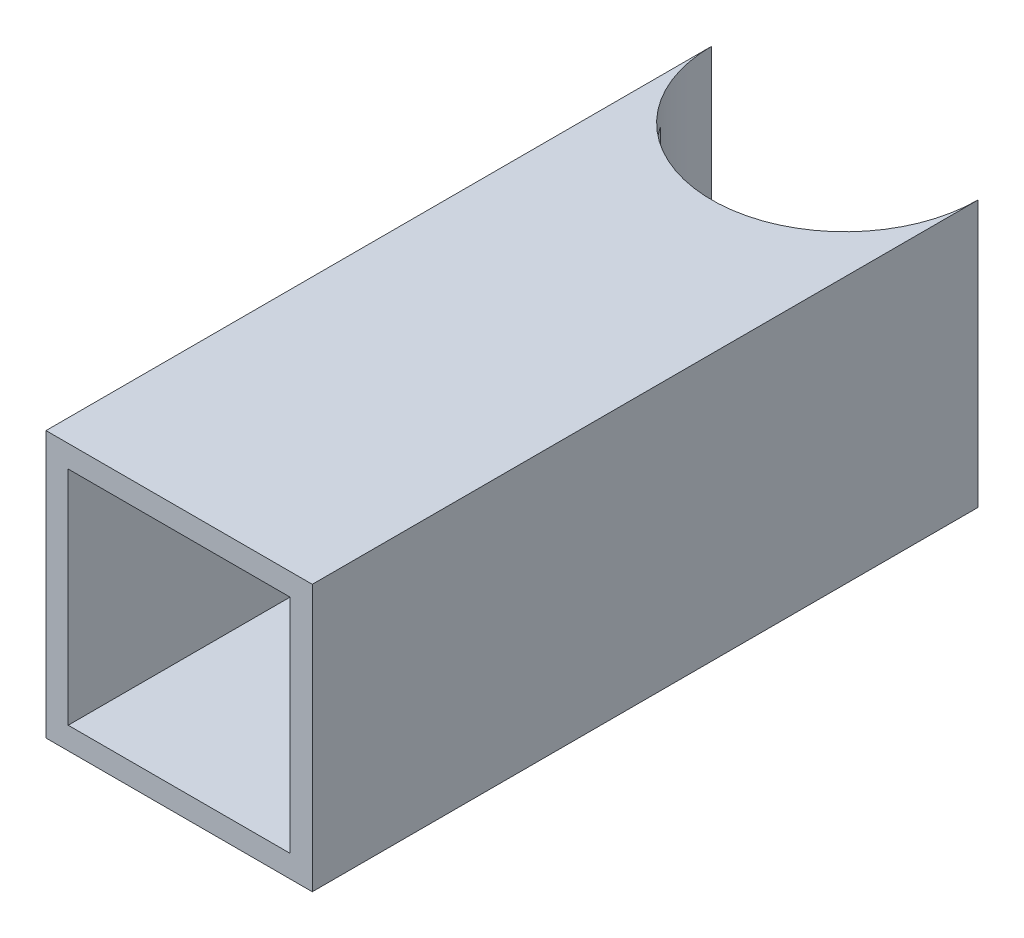
ISO-10303-21;
HEADER;
FILE_DESCRIPTION(('STEP AP214'),'2;1');
FILE_NAME('part.step','',(''),(''),'','','');
FILE_SCHEMA(('AUTOMOTIVE_DESIGN { 1 0 10303 214 1 1 1 1 }'));
ENDSEC;
DATA;
#1=APPLICATION_CONTEXT('core data for automotive mechanical design processes');
#2=APPLICATION_PROTOCOL_DEFINITION('international standard','automotive_design',2000,#1);
#3=PRODUCT_CONTEXT('',#1,'mechanical');
#4=PRODUCT('Part','Part','',(#3));
#5=PRODUCT_RELATED_PRODUCT_CATEGORY('part','',(#4));
#6=PRODUCT_DEFINITION_FORMATION('','',#4);
#7=PRODUCT_DEFINITION_CONTEXT('part definition',#1,'design');
#8=PRODUCT_DEFINITION('design','',#6,#7);
#9=PRODUCT_DEFINITION_SHAPE('','',#8);
#10=(LENGTH_UNIT() NAMED_UNIT(*) SI_UNIT(.MILLI.,.METRE.));
#11=(NAMED_UNIT(*) PLANE_ANGLE_UNIT() SI_UNIT($,.RADIAN.));
#12=(NAMED_UNIT(*) SI_UNIT($,.STERADIAN.) SOLID_ANGLE_UNIT());
#13=UNCERTAINTY_MEASURE_WITH_UNIT(LENGTH_MEASURE(1.E-05),#10,'distance_accuracy_value','');
#14=(GEOMETRIC_REPRESENTATION_CONTEXT(3) GLOBAL_UNCERTAINTY_ASSIGNED_CONTEXT((#13)) GLOBAL_UNIT_ASSIGNED_CONTEXT((#10,
#11,#12)) REPRESENTATION_CONTEXT('',''));
#15=CARTESIAN_POINT('',(0.,0.,0.));
#16=DIRECTION('',(0.,0.,1.));
#17=DIRECTION('',(1.,0.,0.));
#18=AXIS2_PLACEMENT_3D('',#15,#16,#17);
#19=CARTESIAN_POINT('',(0.,0.,75.));
#20=DIRECTION('',(0.,0.,-1.));
#21=DIRECTION('',(-1.,0.,0.));
#22=AXIS2_PLACEMENT_3D('',#19,#20,#21);
#23=PLANE('',#22);
#24=DIRECTION('',(0.,1.,0.));
#25=VECTOR('',#24,1.);
#26=CARTESIAN_POINT('',(15.,-15.,75.));
#27=LINE('',#26,#25);
#28=CARTESIAN_POINT('',(15.,-15.,75.));
#29=VERTEX_POINT('',#28);
#30=CARTESIAN_POINT('',(15.,15.,75.));
#31=VERTEX_POINT('',#30);
#32=EDGE_CURVE('E125',#29,#31,#27,.T.);
#33=ORIENTED_EDGE('',*,*,#32,.T.);
#34=DIRECTION('',(-1.,0.,0.));
#35=VECTOR('',#34,1.);
#36=CARTESIAN_POINT('',(-15.,15.,75.));
#37=LINE('',#36,#35);
#38=CARTESIAN_POINT('',(-15.,15.,75.));
#39=VERTEX_POINT('',#38);
#40=EDGE_CURVE('E115',#31,#39,#37,.T.);
#41=ORIENTED_EDGE('',*,*,#40,.T.);
#42=DIRECTION('',(0.,-1.,0.));
#43=VECTOR('',#42,1.);
#44=CARTESIAN_POINT('',(-15.,-15.,75.));
#45=LINE('',#44,#43);
#46=CARTESIAN_POINT('',(-15.,-15.,75.));
#47=VERTEX_POINT('',#46);
#48=EDGE_CURVE('E142',#39,#47,#45,.T.);
#49=ORIENTED_EDGE('',*,*,#48,.T.);
#50=DIRECTION('',(1.,0.,0.));
#51=VECTOR('',#50,1.);
#52=CARTESIAN_POINT('',(-15.,-15.,75.));
#53=LINE('',#52,#51);
#54=EDGE_CURVE('E131',#47,#29,#53,.T.);
#55=ORIENTED_EDGE('',*,*,#54,.T.);
#56=EDGE_LOOP('',(#33,#41,#49,#55));
#57=FACE_BOUND('',#56,.T.);
#58=DIRECTION('',(0.,1.,0.));
#59=VECTOR('',#58,1.);
#60=CARTESIAN_POINT('',(12.5,-12.5,75.));
#61=LINE('',#60,#59);
#62=CARTESIAN_POINT('',(12.5,-12.5,75.));
#63=VERTEX_POINT('',#62);
#64=CARTESIAN_POINT('',(12.5,12.5,75.));
#65=VERTEX_POINT('',#64);
#66=EDGE_CURVE('E160',#63,#65,#61,.T.);
#67=ORIENTED_EDGE('',*,*,#66,.F.);
#68=DIRECTION('',(1.,0.,0.));
#69=VECTOR('',#68,1.);
#70=CARTESIAN_POINT('',(-12.5,-12.5,75.));
#71=LINE('',#70,#69);
#72=CARTESIAN_POINT('',(-12.5,-12.5,75.));
#73=VERTEX_POINT('',#72);
#74=EDGE_CURVE('E154',#73,#63,#71,.T.);
#75=ORIENTED_EDGE('',*,*,#74,.F.);
#76=DIRECTION('',(0.,-1.,0.));
#77=VECTOR('',#76,1.);
#78=CARTESIAN_POINT('',(-12.5,-12.5,75.));
#79=LINE('',#78,#77);
#80=CARTESIAN_POINT('',(-12.5,12.5,75.));
#81=VERTEX_POINT('',#80);
#82=EDGE_CURVE('E156',#81,#73,#79,.T.);
#83=ORIENTED_EDGE('',*,*,#82,.F.);
#84=DIRECTION('',(-1.,0.,0.));
#85=VECTOR('',#84,1.);
#86=CARTESIAN_POINT('',(-12.5,12.5,75.));
#87=LINE('',#86,#85);
#88=EDGE_CURVE('E158',#65,#81,#87,.T.);
#89=ORIENTED_EDGE('',*,*,#88,.F.);
#90=EDGE_LOOP('',(#67,#75,#83,#89));
#91=FACE_BOUND('',#90,.T.);
#92=ADVANCED_FACE('F37',(#57,#91),#23,.F.);
#93=CARTESIAN_POINT('',(15.,-15.,75.));
#94=DIRECTION('',(-1.,0.,0.));
#95=DIRECTION('',(0.,0.,1.));
#96=AXIS2_PLACEMENT_3D('',#93,#94,#95);
#97=PLANE('',#96);
#98=DIRECTION('',(0.,1.,0.));
#99=VECTOR('',#98,1.);
#100=CARTESIAN_POINT('',(15.,-15.,0.));
#101=LINE('',#100,#99);
#102=CARTESIAN_POINT('',(15.,-15.,0.));
#103=VERTEX_POINT('',#102);
#104=CARTESIAN_POINT('',(15.,15.,0.));
#105=VERTEX_POINT('',#104);
#106=EDGE_CURVE('E104',#103,#105,#101,.T.);
#107=ORIENTED_EDGE('',*,*,#106,.T.);
#108=DIRECTION('',(0.,0.,-1.));
#109=VECTOR('',#108,1.);
#110=CARTESIAN_POINT('',(15.,15.,75.));
#111=LINE('',#110,#109);
#112=EDGE_CURVE('E45',#31,#105,#111,.T.);
#113=ORIENTED_EDGE('',*,*,#112,.F.);
#114=ORIENTED_EDGE('',*,*,#32,.F.);
#115=DIRECTION('',(0.,0.,-1.));
#116=VECTOR('',#115,1.);
#117=CARTESIAN_POINT('',(15.,-15.,75.));
#118=LINE('',#117,#116);
#119=EDGE_CURVE('E122',#29,#103,#118,.T.);
#120=ORIENTED_EDGE('',*,*,#119,.T.);
#121=EDGE_LOOP('',(#107,#113,#114,#120));
#122=FACE_BOUND('',#121,.T.);
#123=ADVANCED_FACE('F39',(#122),#97,.F.);
#124=CARTESIAN_POINT('',(-15.,15.,75.));
#125=DIRECTION('',(0.,-1.,0.));
#126=DIRECTION('',(0.,0.,-1.));
#127=AXIS2_PLACEMENT_3D('',#124,#125,#126);
#128=PLANE('',#127);
#129=ORIENTED_EDGE('',*,*,#112,.T.);
#130=CARTESIAN_POINT('',(0.,15.,0.));
#131=DIRECTION('',(0.,-1.,0.));
#132=DIRECTION('',(0.,0.,-1.));
#133=AXIS2_PLACEMENT_3D('',#130,#131,#132);
#134=CIRCLE('',#133,15.);
#135=CARTESIAN_POINT('',(-15.,15.,0.));
#136=VERTEX_POINT('',#135);
#137=EDGE_CURVE('E100',#105,#136,#134,.T.);
#138=ORIENTED_EDGE('',*,*,#137,.T.);
#139=DIRECTION('',(0.,0.,-1.));
#140=VECTOR('',#139,1.);
#141=CARTESIAN_POINT('',(-15.,15.,75.));
#142=LINE('',#141,#140);
#143=EDGE_CURVE('E119',#39,#136,#142,.T.);
#144=ORIENTED_EDGE('',*,*,#143,.F.);
#145=ORIENTED_EDGE('',*,*,#40,.F.);
#146=EDGE_LOOP('',(#129,#138,#144,#145));
#147=FACE_BOUND('',#146,.T.);
#148=ADVANCED_FACE('F114',(#147),#128,.F.);
#149=CARTESIAN_POINT('',(-15.,-15.,75.));
#150=DIRECTION('',(1.,0.,0.));
#151=DIRECTION('',(0.,0.,-1.));
#152=AXIS2_PLACEMENT_3D('',#149,#150,#151);
#153=PLANE('',#152);
#154=DIRECTION('',(0.,-1.,0.));
#155=VECTOR('',#154,1.);
#156=CARTESIAN_POINT('',(-15.,-15.,0.));
#157=LINE('',#156,#155);
#158=CARTESIAN_POINT('',(-15.,-15.,0.));
#159=VERTEX_POINT('',#158);
#160=EDGE_CURVE('E107',#136,#159,#157,.T.);
#161=ORIENTED_EDGE('',*,*,#160,.T.);
#162=DIRECTION('',(0.,0.,-1.));
#163=VECTOR('',#162,1.);
#164=CARTESIAN_POINT('',(-15.,-15.,75.));
#165=LINE('',#164,#163);
#166=EDGE_CURVE('E135',#47,#159,#165,.T.);
#167=ORIENTED_EDGE('',*,*,#166,.F.);
#168=ORIENTED_EDGE('',*,*,#48,.F.);
#169=ORIENTED_EDGE('',*,*,#143,.T.);
#170=EDGE_LOOP('',(#161,#167,#168,#169));
#171=FACE_BOUND('',#170,.T.);
#172=ADVANCED_FACE('F140',(#171),#153,.F.);
#173=CARTESIAN_POINT('',(-15.,-15.,75.));
#174=DIRECTION('',(0.,1.,0.));
#175=DIRECTION('',(0.,0.,1.));
#176=AXIS2_PLACEMENT_3D('',#173,#174,#175);
#177=PLANE('',#176);
#178=ORIENTED_EDGE('',*,*,#166,.T.);
#179=CARTESIAN_POINT('',(0.,-15.,0.));
#180=DIRECTION('',(0.,-1.,0.));
#181=DIRECTION('',(0.,0.,-1.));
#182=AXIS2_PLACEMENT_3D('',#179,#180,#181);
#183=CIRCLE('',#182,15.);
#184=EDGE_CURVE('E111',#103,#159,#183,.T.);
#185=ORIENTED_EDGE('',*,*,#184,.F.);
#186=ORIENTED_EDGE('',*,*,#119,.F.);
#187=ORIENTED_EDGE('',*,*,#54,.F.);
#188=EDGE_LOOP('',(#178,#185,#186,#187));
#189=FACE_BOUND('',#188,.T.);
#190=ADVANCED_FACE('F168',(#189),#177,.F.);
#191=CARTESIAN_POINT('',(12.5,-12.5,75.));
#192=DIRECTION('',(-1.,0.,0.));
#193=DIRECTION('',(0.,0.,1.));
#194=AXIS2_PLACEMENT_3D('',#191,#192,#193);
#195=PLANE('',#194);
#196=DIRECTION('',(0.,-1.,0.));
#197=VECTOR('',#196,1.);
#198=CARTESIAN_POINT('',(12.5,15.,8.2915619758885));
#199=LINE('',#198,#197);
#200=CARTESIAN_POINT('',(12.5,-12.5,8.2915619758885));
#201=VERTEX_POINT('',#200);
#202=CARTESIAN_POINT('',(12.5,12.5,8.2915619758885));
#203=VERTEX_POINT('',#202);
#204=EDGE_CURVE('E162',#201,#203,#199,.F.);
#205=ORIENTED_EDGE('',*,*,#204,.F.);
#206=DIRECTION('',(0.,0.,-1.));
#207=VECTOR('',#206,1.);
#208=CARTESIAN_POINT('',(12.5,-12.5,75.));
#209=LINE('',#208,#207);
#210=EDGE_CURVE('E151',#63,#201,#209,.T.);
#211=ORIENTED_EDGE('',*,*,#210,.F.);
#212=ORIENTED_EDGE('',*,*,#66,.T.);
#213=DIRECTION('',(0.,0.,-1.));
#214=VECTOR('',#213,1.);
#215=CARTESIAN_POINT('',(12.5,12.5,75.));
#216=LINE('',#215,#214);
#217=EDGE_CURVE('E123',#65,#203,#216,.T.);
#218=ORIENTED_EDGE('',*,*,#217,.T.);
#219=EDGE_LOOP('',(#205,#211,#212,#218));
#220=FACE_BOUND('',#219,.T.);
#221=ADVANCED_FACE('F180',(#220),#195,.T.);
#222=CARTESIAN_POINT('',(-12.5,12.5,75.));
#223=DIRECTION('',(0.,-1.,0.));
#224=DIRECTION('',(0.,0.,-1.));
#225=AXIS2_PLACEMENT_3D('',#222,#223,#224);
#226=PLANE('',#225);
#227=CARTESIAN_POINT('',(0.,12.5,0.));
#228=DIRECTION('',(0.,-1.,0.));
#229=DIRECTION('',(0.,0.,-1.));
#230=AXIS2_PLACEMENT_3D('',#227,#228,#229);
#231=CIRCLE('',#230,15.);
#232=CARTESIAN_POINT('',(-12.5,12.5,8.2915619758885));
#233=VERTEX_POINT('',#232);
#234=EDGE_CURVE('E164',#203,#233,#231,.T.);
#235=ORIENTED_EDGE('',*,*,#234,.F.);
#236=ORIENTED_EDGE('',*,*,#217,.F.);
#237=ORIENTED_EDGE('',*,*,#88,.T.);
#238=DIRECTION('',(0.,0.,-1.));
#239=VECTOR('',#238,1.);
#240=CARTESIAN_POINT('',(-12.5,12.5,75.));
#241=LINE('',#240,#239);
#242=EDGE_CURVE('E128',#81,#233,#241,.T.);
#243=ORIENTED_EDGE('',*,*,#242,.T.);
#244=EDGE_LOOP('',(#235,#236,#237,#243));
#245=FACE_BOUND('',#244,.T.);
#246=ADVANCED_FACE('F183',(#245),#226,.T.);
#247=CARTESIAN_POINT('',(-12.5,-12.5,75.));
#248=DIRECTION('',(1.,0.,0.));
#249=DIRECTION('',(0.,0.,-1.));
#250=AXIS2_PLACEMENT_3D('',#247,#248,#249);
#251=PLANE('',#250);
#252=DIRECTION('',(0.,-1.,0.));
#253=VECTOR('',#252,1.);
#254=CARTESIAN_POINT('',(-12.5,15.,8.2915619758885));
#255=LINE('',#254,#253);
#256=CARTESIAN_POINT('',(-12.5,-12.5,8.2915619758885));
#257=VERTEX_POINT('',#256);
#258=EDGE_CURVE('E51',#233,#257,#255,.T.);
#259=ORIENTED_EDGE('',*,*,#258,.F.);
#260=ORIENTED_EDGE('',*,*,#242,.F.);
#261=ORIENTED_EDGE('',*,*,#82,.T.);
#262=DIRECTION('',(0.,0.,-1.));
#263=VECTOR('',#262,1.);
#264=CARTESIAN_POINT('',(-12.5,-12.5,75.));
#265=LINE('',#264,#263);
#266=EDGE_CURVE('E58',#73,#257,#265,.T.);
#267=ORIENTED_EDGE('',*,*,#266,.T.);
#268=EDGE_LOOP('',(#259,#260,#261,#267));
#269=FACE_BOUND('',#268,.T.);
#270=ADVANCED_FACE('F186',(#269),#251,.T.);
#271=CARTESIAN_POINT('',(-12.5,-12.5,75.));
#272=DIRECTION('',(0.,1.,0.));
#273=DIRECTION('',(0.,0.,1.));
#274=AXIS2_PLACEMENT_3D('',#271,#272,#273);
#275=PLANE('',#274);
#276=CARTESIAN_POINT('',(0.,-12.5,0.));
#277=DIRECTION('',(0.,1.,0.));
#278=DIRECTION('',(0.,0.,1.));
#279=AXIS2_PLACEMENT_3D('',#276,#277,#278);
#280=CIRCLE('',#279,15.);
#281=EDGE_CURVE('E11',#257,#201,#280,.T.);
#282=ORIENTED_EDGE('',*,*,#281,.F.);
#283=ORIENTED_EDGE('',*,*,#266,.F.);
#284=ORIENTED_EDGE('',*,*,#74,.T.);
#285=ORIENTED_EDGE('',*,*,#210,.T.);
#286=EDGE_LOOP('',(#282,#283,#284,#285));
#287=FACE_BOUND('',#286,.T.);
#288=ADVANCED_FACE('F188',(#287),#275,.T.);
#289=CARTESIAN_POINT('',(0.,15.,0.));
#290=DIRECTION('',(0.,-1.,0.));
#291=DIRECTION('',(0.,0.,-1.));
#292=AXIS2_PLACEMENT_3D('',#289,#290,#291);
#293=CYLINDRICAL_SURFACE('',#292,15.);
#294=ORIENTED_EDGE('',*,*,#106,.F.);
#295=ORIENTED_EDGE('',*,*,#184,.T.);
#296=ORIENTED_EDGE('',*,*,#160,.F.);
#297=ORIENTED_EDGE('',*,*,#137,.F.);
#298=EDGE_LOOP('',(#294,#295,#296,#297));
#299=FACE_BOUND('',#298,.T.);
#300=ORIENTED_EDGE('',*,*,#204,.T.);
#301=ORIENTED_EDGE('',*,*,#234,.T.);
#302=ORIENTED_EDGE('',*,*,#258,.T.);
#303=ORIENTED_EDGE('',*,*,#281,.T.);
#304=EDGE_LOOP('',(#300,#301,#302,#303));
#305=FACE_BOUND('',#304,.T.);
#306=ADVANCED_FACE('F102',(#299,#305),#293,.F.);
#307=CLOSED_SHELL('',(#92,#123,#148,#172,#190,#221,#246,#270,#288,#306));
#308=MANIFOLD_SOLID_BREP('B2',#307);
#309=ADVANCED_BREP_SHAPE_REPRESENTATION('',(#18,#308),#14);
#310=SHAPE_DEFINITION_REPRESENTATION(#9,#309);
ENDSEC;
END-ISO-10303-21;
